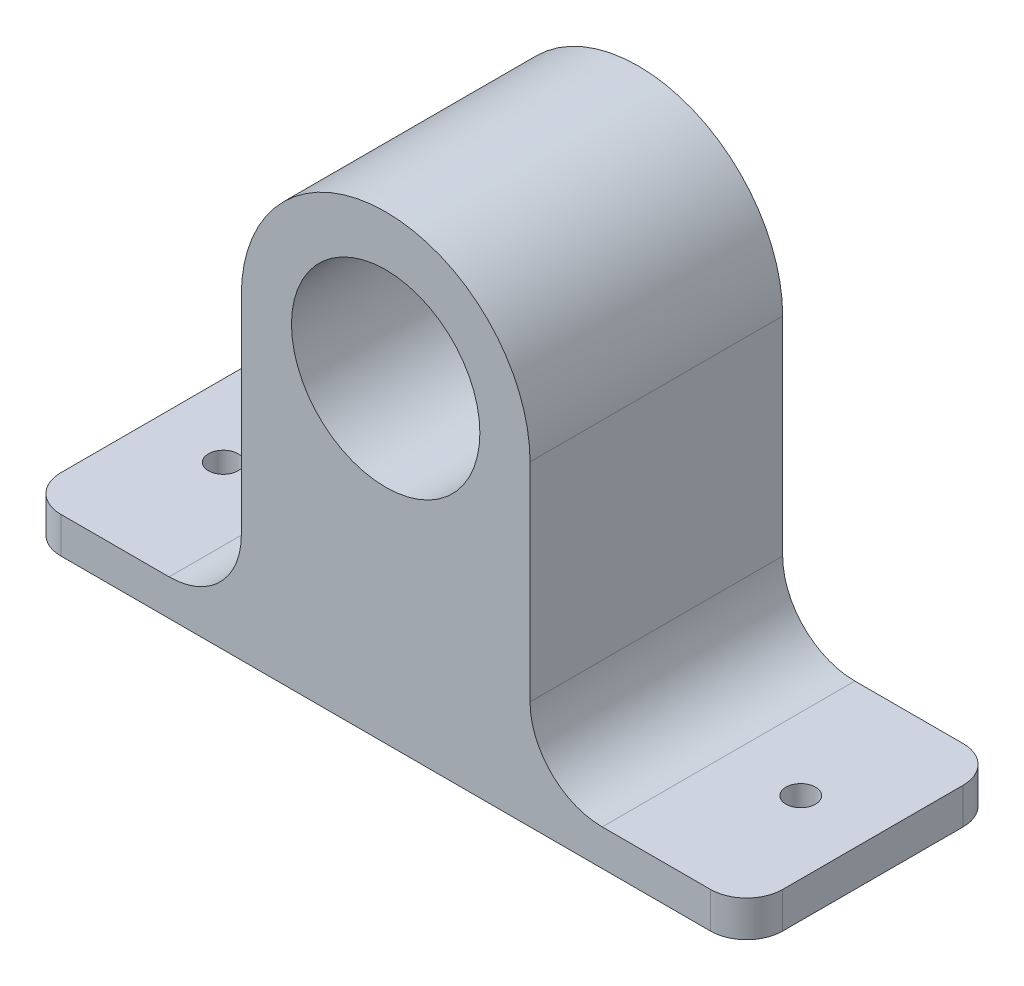
ISO-10303-21;
HEADER;
FILE_DESCRIPTION(('STEP AP214'),'2;1');
FILE_NAME('part.step','',(''),(''),'','','');
FILE_SCHEMA(('AUTOMOTIVE_DESIGN { 1 0 10303 214 1 1 1 1 }'));
ENDSEC;
DATA;
#1=APPLICATION_CONTEXT('core data for automotive mechanical design processes');
#2=APPLICATION_PROTOCOL_DEFINITION('international standard','automotive_design',2000,#1);
#3=PRODUCT_CONTEXT('',#1,'mechanical');
#4=PRODUCT('Part','Part','',(#3));
#5=PRODUCT_RELATED_PRODUCT_CATEGORY('part','',(#4));
#6=PRODUCT_DEFINITION_FORMATION('','',#4);
#7=PRODUCT_DEFINITION_CONTEXT('part definition',#1,'design');
#8=PRODUCT_DEFINITION('design','',#6,#7);
#9=PRODUCT_DEFINITION_SHAPE('','',#8);
#10=(LENGTH_UNIT() NAMED_UNIT(*) SI_UNIT(.MILLI.,.METRE.));
#11=(NAMED_UNIT(*) PLANE_ANGLE_UNIT() SI_UNIT($,.RADIAN.));
#12=(NAMED_UNIT(*) SI_UNIT($,.STERADIAN.) SOLID_ANGLE_UNIT());
#13=UNCERTAINTY_MEASURE_WITH_UNIT(LENGTH_MEASURE(1.E-05),#10,'distance_accuracy_value','');
#14=(GEOMETRIC_REPRESENTATION_CONTEXT(3) GLOBAL_UNCERTAINTY_ASSIGNED_CONTEXT((#13)) GLOBAL_UNIT_ASSIGNED_CONTEXT((#10,
#11,#12)) REPRESENTATION_CONTEXT('',''));
#15=CARTESIAN_POINT('',(0.,0.,0.));
#16=DIRECTION('',(0.,0.,1.));
#17=DIRECTION('',(1.,0.,0.));
#18=AXIS2_PLACEMENT_3D('',#15,#16,#17);
#19=CARTESIAN_POINT('',(20.,0.,35.));
#20=DIRECTION('',(-1.,0.,0.));
#21=DIRECTION('',(0.,-1.,0.));
#22=AXIS2_PLACEMENT_3D('',#19,#20,#21);
#23=PLANE('',#22);
#24=DIRECTION('',(0.,1.,0.));
#25=VECTOR('',#24,1.);
#26=CARTESIAN_POINT('',(20.,0.,35.));
#27=LINE('',#26,#25);
#28=CARTESIAN_POINT('',(20.,12.5,35.));
#29=VERTEX_POINT('',#28);
#30=CARTESIAN_POINT('',(20.,41.3,35.));
#31=VERTEX_POINT('',#30);
#32=EDGE_CURVE('E139',#29,#31,#27,.T.);
#33=ORIENTED_EDGE('',*,*,#32,.F.);
#34=DIRECTION('',(0.,0.,-1.));
#35=VECTOR('',#34,1.);
#36=CARTESIAN_POINT('',(20.,12.5,35.));
#37=LINE('',#36,#35);
#38=CARTESIAN_POINT('',(20.,12.5,0.));
#39=VERTEX_POINT('',#38);
#40=EDGE_CURVE('E177',#29,#39,#37,.T.);
#41=ORIENTED_EDGE('',*,*,#40,.T.);
#42=DIRECTION('',(0.,1.,0.));
#43=VECTOR('',#42,1.);
#44=CARTESIAN_POINT('',(20.,0.,0.));
#45=LINE('',#44,#43);
#46=CARTESIAN_POINT('',(20.,41.3,0.));
#47=VERTEX_POINT('',#46);
#48=EDGE_CURVE('E165',#39,#47,#45,.T.);
#49=ORIENTED_EDGE('',*,*,#48,.T.);
#50=DIRECTION('',(0.,0.,-1.));
#51=VECTOR('',#50,1.);
#52=CARTESIAN_POINT('',(20.,41.3,35.));
#53=LINE('',#52,#51);
#54=EDGE_CURVE('E159',#31,#47,#53,.T.);
#55=ORIENTED_EDGE('',*,*,#54,.F.);
#56=EDGE_LOOP('',(#33,#41,#49,#55));
#57=FACE_BOUND('',#56,.T.);
#58=ADVANCED_FACE('F38',(#57),#23,.F.);
#59=CARTESIAN_POINT('',(0.,41.3,35.));
#60=DIRECTION('',(0.,0.,-1.));
#61=DIRECTION('',(-1.,0.,0.));
#62=AXIS2_PLACEMENT_3D('',#59,#60,#61);
#63=CYLINDRICAL_SURFACE('',#62,20.);
#64=CARTESIAN_POINT('',(0.,41.3,0.));
#65=DIRECTION('',(0.,0.,1.));
#66=DIRECTION('',(1.,0.,0.));
#67=AXIS2_PLACEMENT_3D('',#64,#65,#66);
#68=CIRCLE('',#67,20.);
#69=CARTESIAN_POINT('',(-20.,41.3,0.));
#70=VERTEX_POINT('',#69);
#71=EDGE_CURVE('E264',#47,#70,#68,.T.);
#72=ORIENTED_EDGE('',*,*,#71,.T.);
#73=DIRECTION('',(0.,0.,-1.));
#74=VECTOR('',#73,1.);
#75=CARTESIAN_POINT('',(-20.,41.3,35.));
#76=LINE('',#75,#74);
#77=CARTESIAN_POINT('',(-20.,41.3,35.));
#78=VERTEX_POINT('',#77);
#79=EDGE_CURVE('E161',#78,#70,#76,.T.);
#80=ORIENTED_EDGE('',*,*,#79,.F.);
#81=CARTESIAN_POINT('',(0.,41.3,35.));
#82=DIRECTION('',(0.,0.,1.));
#83=DIRECTION('',(1.,0.,0.));
#84=AXIS2_PLACEMENT_3D('',#81,#82,#83);
#85=CIRCLE('',#84,20.);
#86=EDGE_CURVE('E144',#31,#78,#85,.T.);
#87=ORIENTED_EDGE('',*,*,#86,.F.);
#88=ORIENTED_EDGE('',*,*,#54,.T.);
#89=EDGE_LOOP('',(#72,#80,#87,#88));
#90=FACE_BOUND('',#89,.T.);
#91=ADVANCED_FACE('F158',(#90),#63,.T.);
#92=CARTESIAN_POINT('',(-20.,0.,35.));
#93=DIRECTION('',(-1.,0.,0.));
#94=DIRECTION('',(0.,-1.,0.));
#95=AXIS2_PLACEMENT_3D('',#92,#93,#94);
#96=PLANE('',#95);
#97=DIRECTION('',(0.,1.,0.));
#98=VECTOR('',#97,1.);
#99=CARTESIAN_POINT('',(-20.,0.,0.));
#100=LINE('',#99,#98);
#101=CARTESIAN_POINT('',(-20.,12.5,0.));
#102=VERTEX_POINT('',#101);
#103=EDGE_CURVE('E260',#102,#70,#100,.T.);
#104=ORIENTED_EDGE('',*,*,#103,.F.);
#105=DIRECTION('',(0.,0.,-1.));
#106=VECTOR('',#105,1.);
#107=CARTESIAN_POINT('',(-20.,12.5,35.));
#108=LINE('',#107,#106);
#109=CARTESIAN_POINT('',(-20.,12.5,35.));
#110=VERTEX_POINT('',#109);
#111=EDGE_CURVE('E170',#102,#110,#108,.F.);
#112=ORIENTED_EDGE('',*,*,#111,.T.);
#113=DIRECTION('',(0.,1.,0.));
#114=VECTOR('',#113,1.);
#115=CARTESIAN_POINT('',(-20.,0.,35.));
#116=LINE('',#115,#114);
#117=EDGE_CURVE('E162',#110,#78,#116,.T.);
#118=ORIENTED_EDGE('',*,*,#117,.T.);
#119=ORIENTED_EDGE('',*,*,#79,.T.);
#120=EDGE_LOOP('',(#104,#112,#118,#119));
#121=FACE_BOUND('',#120,.T.);
#122=ADVANCED_FACE('F302',(#121),#96,.T.);
#123=CARTESIAN_POINT('',(0.,2.5,35.));
#124=DIRECTION('',(0.,1.,0.));
#125=DIRECTION('',(0.,0.,1.));
#126=AXIS2_PLACEMENT_3D('',#123,#124,#125);
#127=PLANE('',#126);
#128=CARTESIAN_POINT('',(-40.,2.5,17.5));
#129=DIRECTION('',(0.,1.,0.));
#130=DIRECTION('',(0.,0.,1.));
#131=AXIS2_PLACEMENT_3D('',#128,#129,#130);
#132=CIRCLE('',#131,2.04999999999999);
#133=CARTESIAN_POINT('',(-40.,2.5,19.55));
#134=VERTEX_POINT('',#133);
#135=EDGE_CURVE('E285',#134,#134,#132,.T.);
#136=ORIENTED_EDGE('',*,*,#135,.F.);
#137=EDGE_LOOP('',(#136));
#138=FACE_BOUND('',#137,.T.);
#139=DIRECTION('',(1.,0.,0.));
#140=VECTOR('',#139,1.);
#141=CARTESIAN_POINT('',(0.,2.5,0.));
#142=LINE('',#141,#140);
#143=CARTESIAN_POINT('',(-45.,2.5,0.));
#144=VERTEX_POINT('',#143);
#145=CARTESIAN_POINT('',(-30.,2.5,0.));
#146=VERTEX_POINT('',#145);
#147=EDGE_CURVE('E258',#144,#146,#142,.T.);
#148=ORIENTED_EDGE('',*,*,#147,.F.);
#149=CARTESIAN_POINT('',(-45.,2.5,5.));
#150=DIRECTION('',(0.,1.,0.));
#151=DIRECTION('',(0.,0.,1.));
#152=AXIS2_PLACEMENT_3D('',#149,#150,#151);
#153=CIRCLE('',#152,5.);
#154=CARTESIAN_POINT('',(-50.,2.5,5.));
#155=VERTEX_POINT('',#154);
#156=EDGE_CURVE('E209',#144,#155,#153,.T.);
#157=ORIENTED_EDGE('',*,*,#156,.T.);
#158=DIRECTION('',(0.,0.,-1.));
#159=VECTOR('',#158,1.);
#160=CARTESIAN_POINT('',(-50.,2.5,35.));
#161=LINE('',#160,#159);
#162=CARTESIAN_POINT('',(-50.,2.5,30.));
#163=VERTEX_POINT('',#162);
#164=EDGE_CURVE('E172',#163,#155,#161,.T.);
#165=ORIENTED_EDGE('',*,*,#164,.F.);
#166=CARTESIAN_POINT('',(-45.,2.5,30.));
#167=DIRECTION('',(0.,1.,0.));
#168=DIRECTION('',(0.,0.,1.));
#169=AXIS2_PLACEMENT_3D('',#166,#167,#168);
#170=CIRCLE('',#169,5.);
#171=CARTESIAN_POINT('',(-45.,2.5,35.));
#172=VERTEX_POINT('',#171);
#173=EDGE_CURVE('E207',#163,#172,#170,.T.);
#174=ORIENTED_EDGE('',*,*,#173,.T.);
#175=DIRECTION('',(1.,0.,0.));
#176=VECTOR('',#175,1.);
#177=CARTESIAN_POINT('',(0.,2.5,35.));
#178=LINE('',#177,#176);
#179=CARTESIAN_POINT('',(-30.,2.5,35.));
#180=VERTEX_POINT('',#179);
#181=EDGE_CURVE('E274',#172,#180,#178,.T.);
#182=ORIENTED_EDGE('',*,*,#181,.T.);
#183=DIRECTION('',(0.,0.,-1.));
#184=VECTOR('',#183,1.);
#185=CARTESIAN_POINT('',(-30.,2.5,0.));
#186=LINE('',#185,#184);
#187=EDGE_CURVE('E167',#180,#146,#186,.T.);
#188=ORIENTED_EDGE('',*,*,#187,.T.);
#189=EDGE_LOOP('',(#148,#157,#165,#174,#182,#188));
#190=FACE_BOUND('',#189,.T.);
#191=ADVANCED_FACE('F300',(#138,#190),#127,.T.);
#192=CARTESIAN_POINT('',(-50.,0.,35.));
#193=DIRECTION('',(1.,0.,0.));
#194=DIRECTION('',(0.,1.,0.));
#195=AXIS2_PLACEMENT_3D('',#192,#193,#194);
#196=PLANE('',#195);
#197=ORIENTED_EDGE('',*,*,#164,.T.);
#198=DIRECTION('',(0.,-1.,0.));
#199=VECTOR('',#198,1.);
#200=CARTESIAN_POINT('',(-50.,0.,5.));
#201=LINE('',#200,#199);
#202=CARTESIAN_POINT('',(-50.,-2.5,5.));
#203=VERTEX_POINT('',#202);
#204=EDGE_CURVE('E191',#155,#203,#201,.T.);
#205=ORIENTED_EDGE('',*,*,#204,.T.);
#206=DIRECTION('',(0.,0.,-1.));
#207=VECTOR('',#206,1.);
#208=CARTESIAN_POINT('',(-50.,-2.5,35.));
#209=LINE('',#208,#207);
#210=CARTESIAN_POINT('',(-50.,-2.5,30.));
#211=VERTEX_POINT('',#210);
#212=EDGE_CURVE('E231',#211,#203,#209,.T.);
#213=ORIENTED_EDGE('',*,*,#212,.F.);
#214=DIRECTION('',(0.,-1.,0.));
#215=VECTOR('',#214,1.);
#216=CARTESIAN_POINT('',(-50.,2.5,30.));
#217=LINE('',#216,#215);
#218=EDGE_CURVE('E189',#211,#163,#217,.F.);
#219=ORIENTED_EDGE('',*,*,#218,.T.);
#220=EDGE_LOOP('',(#197,#205,#213,#219));
#221=FACE_BOUND('',#220,.T.);
#222=ADVANCED_FACE('F241',(#221),#196,.F.);
#223=CARTESIAN_POINT('',(0.,-2.5,35.));
#224=DIRECTION('',(0.,1.,0.));
#225=DIRECTION('',(-1.,0.,0.));
#226=AXIS2_PLACEMENT_3D('',#223,#224,#225);
#227=PLANE('',#226);
#228=CARTESIAN_POINT('',(-40.,-2.5,17.5));
#229=DIRECTION('',(0.,1.,0.));
#230=DIRECTION('',(0.,0.,1.));
#231=AXIS2_PLACEMENT_3D('',#228,#229,#230);
#232=CIRCLE('',#231,2.04999999999999);
#233=CARTESIAN_POINT('',(-40.,-2.5,19.55));
#234=VERTEX_POINT('',#233);
#235=EDGE_CURVE('E270',#234,#234,#232,.T.);
#236=ORIENTED_EDGE('',*,*,#235,.T.);
#237=EDGE_LOOP('',(#236));
#238=FACE_BOUND('',#237,.T.);
#239=CARTESIAN_POINT('',(40.,-2.5,17.5));
#240=DIRECTION('',(0.,1.,0.));
#241=DIRECTION('',(0.,0.,-1.));
#242=AXIS2_PLACEMENT_3D('',#239,#240,#241);
#243=CIRCLE('',#242,2.04999999999999);
#244=CARTESIAN_POINT('',(40.,-2.5,15.45));
#245=VERTEX_POINT('',#244);
#246=EDGE_CURVE('E282',#245,#245,#243,.T.);
#247=ORIENTED_EDGE('',*,*,#246,.T.);
#248=EDGE_LOOP('',(#247));
#249=FACE_BOUND('',#248,.T.);
#250=ORIENTED_EDGE('',*,*,#212,.T.);
#251=CARTESIAN_POINT('',(-45.,-2.5,5.));
#252=DIRECTION('',(0.,1.,0.));
#253=DIRECTION('',(-1.,0.,0.));
#254=AXIS2_PLACEMENT_3D('',#251,#252,#253);
#255=CIRCLE('',#254,5.);
#256=CARTESIAN_POINT('',(-45.,-2.5,0.));
#257=VERTEX_POINT('',#256);
#258=EDGE_CURVE('E200',#203,#257,#255,.F.);
#259=ORIENTED_EDGE('',*,*,#258,.T.);
#260=DIRECTION('',(1.,0.,0.));
#261=VECTOR('',#260,1.);
#262=CARTESIAN_POINT('',(0.,-2.5,0.));
#263=LINE('',#262,#261);
#264=CARTESIAN_POINT('',(45.,-2.5,0.));
#265=VERTEX_POINT('',#264);
#266=EDGE_CURVE('E251',#257,#265,#263,.T.);
#267=ORIENTED_EDGE('',*,*,#266,.T.);
#268=CARTESIAN_POINT('',(45.,-2.5,5.));
#269=DIRECTION('',(0.,1.,0.));
#270=DIRECTION('',(-1.,0.,0.));
#271=AXIS2_PLACEMENT_3D('',#268,#269,#270);
#272=CIRCLE('',#271,5.);
#273=CARTESIAN_POINT('',(50.,-2.5,5.));
#274=VERTEX_POINT('',#273);
#275=EDGE_CURVE('E196',#265,#274,#272,.F.);
#276=ORIENTED_EDGE('',*,*,#275,.T.);
#277=DIRECTION('',(0.,0.,-1.));
#278=VECTOR('',#277,1.);
#279=CARTESIAN_POINT('',(50.,-2.5,35.));
#280=LINE('',#279,#278);
#281=CARTESIAN_POINT('',(50.,-2.5,30.));
#282=VERTEX_POINT('',#281);
#283=EDGE_CURVE('E222',#282,#274,#280,.T.);
#284=ORIENTED_EDGE('',*,*,#283,.F.);
#285=CARTESIAN_POINT('',(45.,-2.5,30.));
#286=DIRECTION('',(0.,1.,0.));
#287=DIRECTION('',(-1.,0.,0.));
#288=AXIS2_PLACEMENT_3D('',#285,#286,#287);
#289=CIRCLE('',#288,5.);
#290=CARTESIAN_POINT('',(45.,-2.5,35.));
#291=VERTEX_POINT('',#290);
#292=EDGE_CURVE('E194',#282,#291,#289,.F.);
#293=ORIENTED_EDGE('',*,*,#292,.T.);
#294=DIRECTION('',(1.,0.,0.));
#295=VECTOR('',#294,1.);
#296=CARTESIAN_POINT('',(0.,-2.5,35.));
#297=LINE('',#296,#295);
#298=CARTESIAN_POINT('',(-45.,-2.5,35.));
#299=VERTEX_POINT('',#298);
#300=EDGE_CURVE('E272',#299,#291,#297,.T.);
#301=ORIENTED_EDGE('',*,*,#300,.F.);
#302=CARTESIAN_POINT('',(-45.,-2.5,30.));
#303=DIRECTION('',(0.,1.,0.));
#304=DIRECTION('',(-1.,0.,0.));
#305=AXIS2_PLACEMENT_3D('',#302,#303,#304);
#306=CIRCLE('',#305,5.);
#307=EDGE_CURVE('E198',#299,#211,#306,.F.);
#308=ORIENTED_EDGE('',*,*,#307,.T.);
#309=EDGE_LOOP('',(#250,#259,#267,#276,#284,#293,#301,#308));
#310=FACE_BOUND('',#309,.T.);
#311=ADVANCED_FACE('F227',(#238,#249,#310),#227,.F.);
#312=CARTESIAN_POINT('',(50.,-1.38777878078144E-13,35.));
#313=DIRECTION('',(1.,0.,0.));
#314=DIRECTION('',(0.,1.,0.));
#315=AXIS2_PLACEMENT_3D('',#312,#313,#314);
#316=PLANE('',#315);
#317=ORIENTED_EDGE('',*,*,#283,.T.);
#318=DIRECTION('',(0.,-1.,0.));
#319=VECTOR('',#318,1.);
#320=CARTESIAN_POINT('',(50.,2.5,5.));
#321=LINE('',#320,#319);
#322=CARTESIAN_POINT('',(50.,2.5,5.));
#323=VERTEX_POINT('',#322);
#324=EDGE_CURVE('E53',#274,#323,#321,.F.);
#325=ORIENTED_EDGE('',*,*,#324,.T.);
#326=DIRECTION('',(0.,0.,-1.));
#327=VECTOR('',#326,1.);
#328=CARTESIAN_POINT('',(50.,2.5,35.));
#329=LINE('',#328,#327);
#330=CARTESIAN_POINT('',(50.,2.5,30.));
#331=VERTEX_POINT('',#330);
#332=EDGE_CURVE('E223',#331,#323,#329,.T.);
#333=ORIENTED_EDGE('',*,*,#332,.F.);
#334=DIRECTION('',(0.,-1.,0.));
#335=VECTOR('',#334,1.);
#336=CARTESIAN_POINT('',(50.,-1.38777878078144E-13,30.));
#337=LINE('',#336,#335);
#338=EDGE_CURVE('E216',#331,#282,#337,.T.);
#339=ORIENTED_EDGE('',*,*,#338,.T.);
#340=EDGE_LOOP('',(#317,#325,#333,#339));
#341=FACE_BOUND('',#340,.T.);
#342=ADVANCED_FACE('F221',(#341),#316,.T.);
#343=CARTESIAN_POINT('',(0.,41.3,35.));
#344=DIRECTION('',(0.,0.,-1.));
#345=DIRECTION('',(-1.,0.,0.));
#346=AXIS2_PLACEMENT_3D('',#343,#344,#345);
#347=CYLINDRICAL_SURFACE('',#346,13.05);
#348=CARTESIAN_POINT('',(0.,41.3,35.));
#349=DIRECTION('',(0.,0.,1.));
#350=DIRECTION('',(1.,0.,0.));
#351=AXIS2_PLACEMENT_3D('',#348,#349,#350);
#352=CIRCLE('',#351,13.05);
#353=CARTESIAN_POINT('',(13.05,41.3,35.));
#354=VERTEX_POINT('',#353);
#355=EDGE_CURVE('E153',#354,#354,#352,.T.);
#356=ORIENTED_EDGE('',*,*,#355,.T.);
#357=EDGE_LOOP('',(#356));
#358=FACE_BOUND('',#357,.T.);
#359=CARTESIAN_POINT('',(0.,41.3,0.));
#360=DIRECTION('',(0.,0.,1.));
#361=DIRECTION('',(1.,0.,0.));
#362=AXIS2_PLACEMENT_3D('',#359,#360,#361);
#363=CIRCLE('',#362,13.05);
#364=CARTESIAN_POINT('',(13.05,41.3,0.));
#365=VERTEX_POINT('',#364);
#366=EDGE_CURVE('E267',#365,#365,#363,.T.);
#367=ORIENTED_EDGE('',*,*,#366,.F.);
#368=EDGE_LOOP('',(#367));
#369=FACE_BOUND('',#368,.T.);
#370=ADVANCED_FACE('F333',(#358,#369),#347,.F.);
#371=CARTESIAN_POINT('',(0.,2.5,35.));
#372=DIRECTION('',(0.,1.,0.));
#373=DIRECTION('',(0.,0.,1.));
#374=AXIS2_PLACEMENT_3D('',#371,#372,#373);
#375=PLANE('',#374);
#376=CARTESIAN_POINT('',(40.,2.5,17.5));
#377=DIRECTION('',(0.,1.,0.));
#378=DIRECTION('',(0.,0.,-1.));
#379=AXIS2_PLACEMENT_3D('',#376,#377,#378);
#380=CIRCLE('',#379,2.04999999999999);
#381=CARTESIAN_POINT('',(40.,2.5,15.45));
#382=VERTEX_POINT('',#381);
#383=EDGE_CURVE('E279',#382,#382,#380,.T.);
#384=ORIENTED_EDGE('',*,*,#383,.F.);
#385=EDGE_LOOP('',(#384));
#386=FACE_BOUND('',#385,.T.);
#387=ORIENTED_EDGE('',*,*,#332,.T.);
#388=CARTESIAN_POINT('',(45.,2.5,5.));
#389=DIRECTION('',(0.,1.,0.));
#390=DIRECTION('',(0.,0.,1.));
#391=AXIS2_PLACEMENT_3D('',#388,#389,#390);
#392=CIRCLE('',#391,5.);
#393=CARTESIAN_POINT('',(45.,2.5,0.));
#394=VERTEX_POINT('',#393);
#395=EDGE_CURVE('E11',#323,#394,#392,.T.);
#396=ORIENTED_EDGE('',*,*,#395,.T.);
#397=DIRECTION('',(1.,0.,0.));
#398=VECTOR('',#397,1.);
#399=CARTESIAN_POINT('',(0.,2.5,0.));
#400=LINE('',#399,#398);
#401=CARTESIAN_POINT('',(30.,2.5,0.));
#402=VERTEX_POINT('',#401);
#403=EDGE_CURVE('E257',#402,#394,#400,.T.);
#404=ORIENTED_EDGE('',*,*,#403,.F.);
#405=DIRECTION('',(0.,0.,-1.));
#406=VECTOR('',#405,1.);
#407=CARTESIAN_POINT('',(30.,2.5,35.));
#408=LINE('',#407,#406);
#409=CARTESIAN_POINT('',(30.,2.5,35.));
#410=VERTEX_POINT('',#409);
#411=EDGE_CURVE('E179',#402,#410,#408,.F.);
#412=ORIENTED_EDGE('',*,*,#411,.T.);
#413=DIRECTION('',(1.,0.,0.));
#414=VECTOR('',#413,1.);
#415=CARTESIAN_POINT('',(0.,2.5,35.));
#416=LINE('',#415,#414);
#417=CARTESIAN_POINT('',(45.,2.5,35.));
#418=VERTEX_POINT('',#417);
#419=EDGE_CURVE('E234',#410,#418,#416,.T.);
#420=ORIENTED_EDGE('',*,*,#419,.T.);
#421=CARTESIAN_POINT('',(45.,2.5,30.));
#422=DIRECTION('',(0.,1.,0.));
#423=DIRECTION('',(0.,0.,1.));
#424=AXIS2_PLACEMENT_3D('',#421,#422,#423);
#425=CIRCLE('',#424,5.);
#426=EDGE_CURVE('E46',#418,#331,#425,.T.);
#427=ORIENTED_EDGE('',*,*,#426,.T.);
#428=EDGE_LOOP('',(#387,#396,#404,#412,#420,#427));
#429=FACE_BOUND('',#428,.T.);
#430=ADVANCED_FACE('F336',(#386,#429),#375,.T.);
#431=CARTESIAN_POINT('',(0.,0.,35.));
#432=DIRECTION('',(0.,0.,1.));
#433=DIRECTION('',(1.,0.,0.));
#434=AXIS2_PLACEMENT_3D('',#431,#432,#433);
#435=PLANE('',#434);
#436=ORIENTED_EDGE('',*,*,#355,.F.);
#437=EDGE_LOOP('',(#436));
#438=FACE_BOUND('',#437,.T.);
#439=ORIENTED_EDGE('',*,*,#181,.F.);
#440=DIRECTION('',(0.,-1.,0.));
#441=VECTOR('',#440,1.);
#442=CARTESIAN_POINT('',(-45.,-2.50000000000001,35.));
#443=LINE('',#442,#441);
#444=EDGE_CURVE('E213',#172,#299,#443,.T.);
#445=ORIENTED_EDGE('',*,*,#444,.T.);
#446=ORIENTED_EDGE('',*,*,#300,.T.);
#447=DIRECTION('',(0.,-1.,0.));
#448=VECTOR('',#447,1.);
#449=CARTESIAN_POINT('',(45.,-1.2490009027033E-13,35.));
#450=LINE('',#449,#448);
#451=EDGE_CURVE('E211',#291,#418,#450,.F.);
#452=ORIENTED_EDGE('',*,*,#451,.T.);
#453=ORIENTED_EDGE('',*,*,#419,.F.);
#454=CARTESIAN_POINT('',(30.,12.5,35.));
#455=DIRECTION('',(0.,0.,1.));
#456=DIRECTION('',(1.,0.,0.));
#457=AXIS2_PLACEMENT_3D('',#454,#455,#456);
#458=CIRCLE('',#457,10.);
#459=EDGE_CURVE('E148',#410,#29,#458,.F.);
#460=ORIENTED_EDGE('',*,*,#459,.T.);
#461=ORIENTED_EDGE('',*,*,#32,.T.);
#462=ORIENTED_EDGE('',*,*,#86,.T.);
#463=ORIENTED_EDGE('',*,*,#117,.F.);
#464=CARTESIAN_POINT('',(-30.,12.5,35.));
#465=DIRECTION('',(0.,0.,1.));
#466=DIRECTION('',(1.,0.,0.));
#467=AXIS2_PLACEMENT_3D('',#464,#465,#466);
#468=CIRCLE('',#467,10.);
#469=EDGE_CURVE('E183',#110,#180,#468,.F.);
#470=ORIENTED_EDGE('',*,*,#469,.T.);
#471=EDGE_LOOP('',(#439,#445,#446,#452,#453,#460,#461,#462,#463,#470));
#472=FACE_BOUND('',#471,.T.);
#473=ADVANCED_FACE('F142',(#438,#472),#435,.T.);
#474=CARTESIAN_POINT('',(0.,0.,0.));
#475=DIRECTION('',(0.,0.,1.));
#476=DIRECTION('',(1.,0.,0.));
#477=AXIS2_PLACEMENT_3D('',#474,#475,#476);
#478=PLANE('',#477);
#479=ORIENTED_EDGE('',*,*,#366,.T.);
#480=EDGE_LOOP('',(#479));
#481=FACE_BOUND('',#480,.T.);
#482=ORIENTED_EDGE('',*,*,#266,.F.);
#483=DIRECTION('',(0.,-1.,0.));
#484=VECTOR('',#483,1.);
#485=CARTESIAN_POINT('',(-45.,0.,0.));
#486=LINE('',#485,#484);
#487=EDGE_CURVE('E205',#257,#144,#486,.F.);
#488=ORIENTED_EDGE('',*,*,#487,.T.);
#489=ORIENTED_EDGE('',*,*,#147,.T.);
#490=CARTESIAN_POINT('',(-30.,12.5,0.));
#491=DIRECTION('',(0.,0.,1.));
#492=DIRECTION('',(1.,0.,0.));
#493=AXIS2_PLACEMENT_3D('',#490,#491,#492);
#494=CIRCLE('',#493,10.);
#495=EDGE_CURVE('E181',#146,#102,#494,.T.);
#496=ORIENTED_EDGE('',*,*,#495,.T.);
#497=ORIENTED_EDGE('',*,*,#103,.T.);
#498=ORIENTED_EDGE('',*,*,#71,.F.);
#499=ORIENTED_EDGE('',*,*,#48,.F.);
#500=CARTESIAN_POINT('',(30.,12.5,0.));
#501=DIRECTION('',(0.,0.,1.));
#502=DIRECTION('',(1.,0.,0.));
#503=AXIS2_PLACEMENT_3D('',#500,#501,#502);
#504=CIRCLE('',#503,10.);
#505=EDGE_CURVE('E186',#39,#402,#504,.T.);
#506=ORIENTED_EDGE('',*,*,#505,.T.);
#507=ORIENTED_EDGE('',*,*,#403,.T.);
#508=DIRECTION('',(0.,-1.,0.));
#509=VECTOR('',#508,1.);
#510=CARTESIAN_POINT('',(45.,-2.49999999999999,0.));
#511=LINE('',#510,#509);
#512=EDGE_CURVE('E202',#394,#265,#511,.T.);
#513=ORIENTED_EDGE('',*,*,#512,.T.);
#514=EDGE_LOOP('',(#482,#488,#489,#496,#497,#498,#499,#506,#507,#513));
#515=FACE_BOUND('',#514,.T.);
#516=ADVANCED_FACE('F253',(#481,#515),#478,.F.);
#517=CARTESIAN_POINT('',(-30.,12.5,35.));
#518=DIRECTION('',(0.,0.,1.));
#519=DIRECTION('',(1.,0.,0.));
#520=AXIS2_PLACEMENT_3D('',#517,#518,#519);
#521=CYLINDRICAL_SURFACE('',#520,10.);
#522=ORIENTED_EDGE('',*,*,#469,.F.);
#523=ORIENTED_EDGE('',*,*,#111,.F.);
#524=ORIENTED_EDGE('',*,*,#495,.F.);
#525=ORIENTED_EDGE('',*,*,#187,.F.);
#526=EDGE_LOOP('',(#522,#523,#524,#525));
#527=FACE_BOUND('',#526,.T.);
#528=ADVANCED_FACE('F310',(#527),#521,.F.);
#529=CARTESIAN_POINT('',(30.,12.5,35.));
#530=DIRECTION('',(0.,0.,-1.));
#531=DIRECTION('',(-1.,0.,0.));
#532=AXIS2_PLACEMENT_3D('',#529,#530,#531);
#533=CYLINDRICAL_SURFACE('',#532,10.);
#534=ORIENTED_EDGE('',*,*,#459,.F.);
#535=ORIENTED_EDGE('',*,*,#411,.F.);
#536=ORIENTED_EDGE('',*,*,#505,.F.);
#537=ORIENTED_EDGE('',*,*,#40,.F.);
#538=EDGE_LOOP('',(#534,#535,#536,#537));
#539=FACE_BOUND('',#538,.T.);
#540=ADVANCED_FACE('F340',(#539),#533,.F.);
#541=CARTESIAN_POINT('',(-45.,0.,5.));
#542=DIRECTION('',(0.,-1.,0.));
#543=DIRECTION('',(1.,0.,0.));
#544=AXIS2_PLACEMENT_3D('',#541,#542,#543);
#545=CYLINDRICAL_SURFACE('',#544,5.);
#546=ORIENTED_EDGE('',*,*,#156,.F.);
#547=ORIENTED_EDGE('',*,*,#487,.F.);
#548=ORIENTED_EDGE('',*,*,#258,.F.);
#549=ORIENTED_EDGE('',*,*,#204,.F.);
#550=EDGE_LOOP('',(#546,#547,#548,#549));
#551=FACE_BOUND('',#550,.T.);
#552=ADVANCED_FACE('F248',(#551),#545,.T.);
#553=CARTESIAN_POINT('',(-45.,0.,30.));
#554=DIRECTION('',(0.,1.,0.));
#555=DIRECTION('',(-1.,0.,0.));
#556=AXIS2_PLACEMENT_3D('',#553,#554,#555);
#557=CYLINDRICAL_SURFACE('',#556,5.);
#558=ORIENTED_EDGE('',*,*,#173,.F.);
#559=ORIENTED_EDGE('',*,*,#218,.F.);
#560=ORIENTED_EDGE('',*,*,#307,.F.);
#561=ORIENTED_EDGE('',*,*,#444,.F.);
#562=EDGE_LOOP('',(#558,#559,#560,#561));
#563=FACE_BOUND('',#562,.T.);
#564=ADVANCED_FACE('F314',(#563),#557,.T.);
#565=CARTESIAN_POINT('',(45.,-1.2490009027033E-13,5.));
#566=DIRECTION('',(0.,1.,0.));
#567=DIRECTION('',(-1.,0.,0.));
#568=AXIS2_PLACEMENT_3D('',#565,#566,#567);
#569=CYLINDRICAL_SURFACE('',#568,5.);
#570=ORIENTED_EDGE('',*,*,#395,.F.);
#571=ORIENTED_EDGE('',*,*,#324,.F.);
#572=ORIENTED_EDGE('',*,*,#275,.F.);
#573=ORIENTED_EDGE('',*,*,#512,.F.);
#574=EDGE_LOOP('',(#570,#571,#572,#573));
#575=FACE_BOUND('',#574,.T.);
#576=ADVANCED_FACE('F317',(#575),#569,.T.);
#577=CARTESIAN_POINT('',(45.,-1.2490009027033E-13,30.));
#578=DIRECTION('',(0.,-1.,0.));
#579=DIRECTION('',(1.,0.,0.));
#580=AXIS2_PLACEMENT_3D('',#577,#578,#579);
#581=CYLINDRICAL_SURFACE('',#580,5.);
#582=ORIENTED_EDGE('',*,*,#426,.F.);
#583=ORIENTED_EDGE('',*,*,#451,.F.);
#584=ORIENTED_EDGE('',*,*,#292,.F.);
#585=ORIENTED_EDGE('',*,*,#338,.F.);
#586=EDGE_LOOP('',(#582,#583,#584,#585));
#587=FACE_BOUND('',#586,.T.);
#588=ADVANCED_FACE('F40',(#587),#581,.T.);
#589=CARTESIAN_POINT('',(40.,-2.5,17.5));
#590=DIRECTION('',(0.,1.,0.));
#591=DIRECTION('',(0.,0.,1.));
#592=AXIS2_PLACEMENT_3D('',#589,#590,#591);
#593=CYLINDRICAL_SURFACE('',#592,2.04999999999999);
#594=ORIENTED_EDGE('',*,*,#246,.F.);
#595=EDGE_LOOP('',(#594));
#596=FACE_BOUND('',#595,.T.);
#597=ORIENTED_EDGE('',*,*,#383,.T.);
#598=EDGE_LOOP('',(#597));
#599=FACE_BOUND('',#598,.T.);
#600=ADVANCED_FACE('F296',(#596,#599),#593,.F.);
#601=CARTESIAN_POINT('',(-40.,-2.5,17.5));
#602=DIRECTION('',(0.,1.,0.));
#603=DIRECTION('',(0.,0.,1.));
#604=AXIS2_PLACEMENT_3D('',#601,#602,#603);
#605=CYLINDRICAL_SURFACE('',#604,2.04999999999999);
#606=ORIENTED_EDGE('',*,*,#235,.F.);
#607=EDGE_LOOP('',(#606));
#608=FACE_BOUND('',#607,.T.);
#609=ORIENTED_EDGE('',*,*,#135,.T.);
#610=EDGE_LOOP('',(#609));
#611=FACE_BOUND('',#610,.T.);
#612=ADVANCED_FACE('F293',(#608,#611),#605,.F.);
#613=CLOSED_SHELL('',(#58,#91,#122,#191,#222,#311,#342,#370,#430,#473,#516,#528,#540,#552,#564,
#576,#588,#600,#612));
#614=MANIFOLD_SOLID_BREP('B2',#613);
#615=ADVANCED_BREP_SHAPE_REPRESENTATION('',(#18,#614),#14);
#616=SHAPE_DEFINITION_REPRESENTATION(#9,#615);
ENDSEC;
END-ISO-10303-21;
